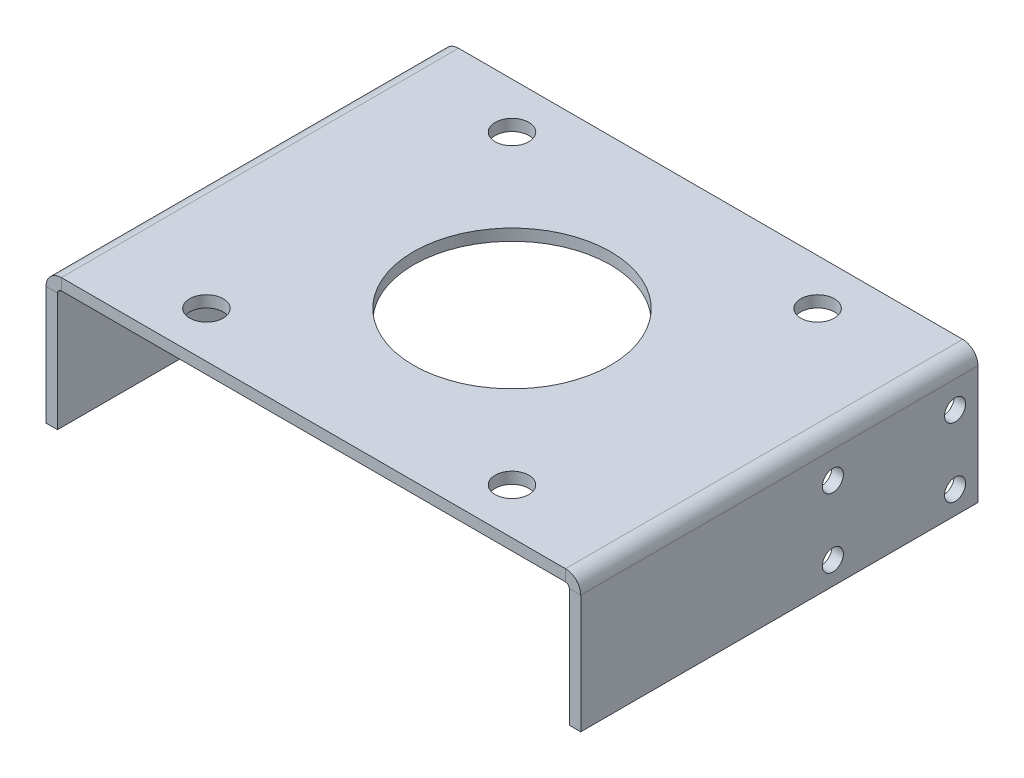
ISO-10303-21;
HEADER;
FILE_DESCRIPTION(('STEP AP214'),'2;1');
FILE_NAME('part.step','',(''),(''),'','','');
FILE_SCHEMA(('AUTOMOTIVE_DESIGN { 1 0 10303 214 1 1 1 1 }'));
ENDSEC;
DATA;
#1=APPLICATION_CONTEXT('core data for automotive mechanical design processes');
#2=APPLICATION_PROTOCOL_DEFINITION('international standard','automotive_design',2000,#1);
#3=PRODUCT_CONTEXT('',#1,'mechanical');
#4=PRODUCT('Part','Part','',(#3));
#5=PRODUCT_RELATED_PRODUCT_CATEGORY('part','',(#4));
#6=PRODUCT_DEFINITION_FORMATION('','',#4);
#7=PRODUCT_DEFINITION_CONTEXT('part definition',#1,'design');
#8=PRODUCT_DEFINITION('design','',#6,#7);
#9=PRODUCT_DEFINITION_SHAPE('','',#8);
#10=(LENGTH_UNIT() NAMED_UNIT(*) SI_UNIT(.MILLI.,.METRE.));
#11=(NAMED_UNIT(*) PLANE_ANGLE_UNIT() SI_UNIT($,.RADIAN.));
#12=(NAMED_UNIT(*) SI_UNIT($,.STERADIAN.) SOLID_ANGLE_UNIT());
#13=UNCERTAINTY_MEASURE_WITH_UNIT(LENGTH_MEASURE(1.E-05),#10,'distance_accuracy_value','');
#14=(GEOMETRIC_REPRESENTATION_CONTEXT(3) GLOBAL_UNCERTAINTY_ASSIGNED_CONTEXT((#13)) GLOBAL_UNIT_ASSIGNED_CONTEXT((#10,
#11,#12)) REPRESENTATION_CONTEXT('',''));
#15=CARTESIAN_POINT('',(0.,0.,0.));
#16=DIRECTION('',(0.,0.,1.));
#17=DIRECTION('',(1.,0.,0.));
#18=AXIS2_PLACEMENT_3D('',#15,#16,#17);
#19=CARTESIAN_POINT('',(-66.,0.,104.));
#20=DIRECTION('',(0.,0.,1.));
#21=DIRECTION('',(1.,0.,0.));
#22=AXIS2_PLACEMENT_3D('',#19,#20,#21);
#23=PLANE('',#22);
#24=DIRECTION('',(0.,-1.,0.));
#25=VECTOR('',#24,1.);
#26=CARTESIAN_POINT('',(-66.,0.,104.));
#27=LINE('',#26,#25);
#28=CARTESIAN_POINT('',(-66.,0.,104.));
#29=VERTEX_POINT('',#28);
#30=CARTESIAN_POINT('',(-66.,-3.,104.));
#31=VERTEX_POINT('',#30);
#32=EDGE_CURVE('E11',#29,#31,#27,.T.);
#33=ORIENTED_EDGE('',*,*,#32,.F.);
#34=CARTESIAN_POINT('',(-66.,-4.,104.));
#35=DIRECTION('',(0.,0.,1.));
#36=DIRECTION('',(1.,0.,0.));
#37=AXIS2_PLACEMENT_3D('',#34,#35,#36);
#38=CIRCLE('',#37,4.);
#39=CARTESIAN_POINT('',(-70.,-4.,104.));
#40=VERTEX_POINT('',#39);
#41=EDGE_CURVE('E250',#40,#29,#38,.F.);
#42=ORIENTED_EDGE('',*,*,#41,.F.);
#43=DIRECTION('',(-1.,0.,0.));
#44=VECTOR('',#43,1.);
#45=CARTESIAN_POINT('',(-67.,-4.,104.));
#46=LINE('',#45,#44);
#47=CARTESIAN_POINT('',(-67.,-4.,104.));
#48=VERTEX_POINT('',#47);
#49=EDGE_CURVE('E47',#48,#40,#46,.T.);
#50=ORIENTED_EDGE('',*,*,#49,.F.);
#51=CARTESIAN_POINT('',(-66.,-4.,104.));
#52=DIRECTION('',(0.,0.,1.));
#53=DIRECTION('',(1.,0.,0.));
#54=AXIS2_PLACEMENT_3D('',#51,#52,#53);
#55=CIRCLE('',#54,1.);
#56=EDGE_CURVE('E148',#48,#31,#55,.F.);
#57=ORIENTED_EDGE('',*,*,#56,.T.);
#58=EDGE_LOOP('',(#33,#42,#50,#57));
#59=FACE_BOUND('',#58,.T.);
#60=ADVANCED_FACE('F39',(#59),#23,.T.);
#61=CARTESIAN_POINT('',(-67.,-4.,104.));
#62=DIRECTION('',(0.,0.,1.));
#63=DIRECTION('',(1.,0.,0.));
#64=AXIS2_PLACEMENT_3D('',#61,#62,#63);
#65=PLANE('',#64);
#66=DIRECTION('',(1.,0.,0.));
#67=VECTOR('',#66,1.);
#68=CARTESIAN_POINT('',(-70.,0.,104.));
#69=LINE('',#68,#67);
#70=CARTESIAN_POINT('',(66.,0.,104.));
#71=VERTEX_POINT('',#70);
#72=EDGE_CURVE('E142',#29,#71,#69,.T.);
#73=ORIENTED_EDGE('',*,*,#72,.F.);
#74=ORIENTED_EDGE('',*,*,#32,.T.);
#75=DIRECTION('',(1.,0.,0.));
#76=VECTOR('',#75,1.);
#77=CARTESIAN_POINT('',(-70.,-3.,104.));
#78=LINE('',#77,#76);
#79=CARTESIAN_POINT('',(66.,-3.,104.));
#80=VERTEX_POINT('',#79);
#81=EDGE_CURVE('E139',#31,#80,#78,.T.);
#82=ORIENTED_EDGE('',*,*,#81,.T.);
#83=DIRECTION('',(0.,1.,0.));
#84=VECTOR('',#83,1.);
#85=CARTESIAN_POINT('',(66.,-3.,104.));
#86=LINE('',#85,#84);
#87=EDGE_CURVE('E231',#80,#71,#86,.T.);
#88=ORIENTED_EDGE('',*,*,#87,.T.);
#89=EDGE_LOOP('',(#73,#74,#82,#88));
#90=FACE_BOUND('',#89,.T.);
#91=ADVANCED_FACE('F137',(#90),#65,.T.);
#92=CARTESIAN_POINT('',(-70.,-4.,0.));
#93=DIRECTION('',(0.,0.,-1.));
#94=DIRECTION('',(-1.,0.,0.));
#95=AXIS2_PLACEMENT_3D('',#92,#93,#94);
#96=PLANE('',#95);
#97=DIRECTION('',(1.,0.,0.));
#98=VECTOR('',#97,1.);
#99=CARTESIAN_POINT('',(-70.,-4.,0.));
#100=LINE('',#99,#98);
#101=CARTESIAN_POINT('',(-70.,-4.,0.));
#102=VERTEX_POINT('',#101);
#103=CARTESIAN_POINT('',(-67.,-4.,0.));
#104=VERTEX_POINT('',#103);
#105=EDGE_CURVE('E236',#102,#104,#100,.T.);
#106=ORIENTED_EDGE('',*,*,#105,.F.);
#107=CARTESIAN_POINT('',(-66.,-4.,0.));
#108=DIRECTION('',(0.,0.,1.));
#109=DIRECTION('',(1.,0.,0.));
#110=AXIS2_PLACEMENT_3D('',#107,#108,#109);
#111=CIRCLE('',#110,4.);
#112=CARTESIAN_POINT('',(-66.,0.,0.));
#113=VERTEX_POINT('',#112);
#114=EDGE_CURVE('E188',#102,#113,#111,.F.);
#115=ORIENTED_EDGE('',*,*,#114,.T.);
#116=DIRECTION('',(0.,1.,0.));
#117=VECTOR('',#116,1.);
#118=CARTESIAN_POINT('',(-66.,-3.,0.));
#119=LINE('',#118,#117);
#120=CARTESIAN_POINT('',(-66.,-3.,0.));
#121=VERTEX_POINT('',#120);
#122=EDGE_CURVE('E234',#121,#113,#119,.T.);
#123=ORIENTED_EDGE('',*,*,#122,.F.);
#124=CARTESIAN_POINT('',(-66.,-4.,0.));
#125=DIRECTION('',(0.,0.,1.));
#126=DIRECTION('',(1.,0.,0.));
#127=AXIS2_PLACEMENT_3D('',#124,#125,#126);
#128=CIRCLE('',#127,1.);
#129=EDGE_CURVE('E160',#104,#121,#128,.F.);
#130=ORIENTED_EDGE('',*,*,#129,.F.);
#131=EDGE_LOOP('',(#106,#115,#123,#130));
#132=FACE_BOUND('',#131,.T.);
#133=ADVANCED_FACE('F372',(#132),#96,.T.);
#134=CARTESIAN_POINT('',(-66.,-3.,0.));
#135=DIRECTION('',(0.,0.,-1.));
#136=DIRECTION('',(-1.,0.,0.));
#137=AXIS2_PLACEMENT_3D('',#134,#135,#136);
#138=PLANE('',#137);
#139=DIRECTION('',(0.,1.,0.));
#140=VECTOR('',#139,1.);
#141=CARTESIAN_POINT('',(-70.,0.,0.));
#142=LINE('',#141,#140);
#143=CARTESIAN_POINT('',(-70.,-35.,0.));
#144=VERTEX_POINT('',#143);
#145=EDGE_CURVE('E191',#144,#102,#142,.T.);
#146=ORIENTED_EDGE('',*,*,#145,.T.);
#147=ORIENTED_EDGE('',*,*,#105,.T.);
#148=DIRECTION('',(0.,1.,0.));
#149=VECTOR('',#148,1.);
#150=CARTESIAN_POINT('',(-67.,0.,0.));
#151=LINE('',#150,#149);
#152=CARTESIAN_POINT('',(-67.,-35.,0.));
#153=VERTEX_POINT('',#152);
#154=EDGE_CURVE('E197',#153,#104,#151,.T.);
#155=ORIENTED_EDGE('',*,*,#154,.F.);
#156=DIRECTION('',(-1.,0.,0.));
#157=VECTOR('',#156,1.);
#158=CARTESIAN_POINT('',(-67.,-35.,0.));
#159=LINE('',#158,#157);
#160=EDGE_CURVE('E194',#153,#144,#159,.T.);
#161=ORIENTED_EDGE('',*,*,#160,.T.);
#162=EDGE_LOOP('',(#146,#147,#155,#161));
#163=FACE_BOUND('',#162,.T.);
#164=ADVANCED_FACE('F375',(#163),#138,.T.);
#165=CARTESIAN_POINT('',(70.,-4.,104.));
#166=DIRECTION('',(0.,0.,1.));
#167=DIRECTION('',(1.,0.,0.));
#168=AXIS2_PLACEMENT_3D('',#165,#166,#167);
#169=PLANE('',#168);
#170=DIRECTION('',(-1.,0.,0.));
#171=VECTOR('',#170,1.);
#172=CARTESIAN_POINT('',(70.,-4.,104.));
#173=LINE('',#172,#171);
#174=CARTESIAN_POINT('',(70.,-4.,104.));
#175=VERTEX_POINT('',#174);
#176=CARTESIAN_POINT('',(67.,-4.,104.));
#177=VERTEX_POINT('',#176);
#178=EDGE_CURVE('E55',#175,#177,#173,.T.);
#179=ORIENTED_EDGE('',*,*,#178,.F.);
#180=CARTESIAN_POINT('',(66.,-4.,104.));
#181=DIRECTION('',(0.,0.,1.));
#182=DIRECTION('',(1.,0.,0.));
#183=AXIS2_PLACEMENT_3D('',#180,#181,#182);
#184=CIRCLE('',#183,4.);
#185=EDGE_CURVE('E260',#71,#175,#184,.F.);
#186=ORIENTED_EDGE('',*,*,#185,.F.);
#187=ORIENTED_EDGE('',*,*,#87,.F.);
#188=CARTESIAN_POINT('',(66.,-4.,104.));
#189=DIRECTION('',(0.,0.,1.));
#190=DIRECTION('',(1.,0.,0.));
#191=AXIS2_PLACEMENT_3D('',#188,#189,#190);
#192=CIRCLE('',#191,1.);
#193=EDGE_CURVE('E168',#80,#177,#192,.F.);
#194=ORIENTED_EDGE('',*,*,#193,.T.);
#195=EDGE_LOOP('',(#179,#186,#187,#194));
#196=FACE_BOUND('',#195,.T.);
#197=ADVANCED_FACE('F402',(#196),#169,.T.);
#198=CARTESIAN_POINT('',(66.,-3.,104.));
#199=DIRECTION('',(0.,0.,1.));
#200=DIRECTION('',(1.,0.,0.));
#201=AXIS2_PLACEMENT_3D('',#198,#199,#200);
#202=PLANE('',#201);
#203=DIRECTION('',(0.,-1.,0.));
#204=VECTOR('',#203,1.);
#205=CARTESIAN_POINT('',(70.,0.,104.));
#206=LINE('',#205,#204);
#207=CARTESIAN_POINT('',(70.,-35.,104.));
#208=VERTEX_POINT('',#207);
#209=EDGE_CURVE('E263',#175,#208,#206,.T.);
#210=ORIENTED_EDGE('',*,*,#209,.F.);
#211=ORIENTED_EDGE('',*,*,#178,.T.);
#212=DIRECTION('',(0.,-1.,0.));
#213=VECTOR('',#212,1.);
#214=CARTESIAN_POINT('',(67.,0.,104.));
#215=LINE('',#214,#213);
#216=CARTESIAN_POINT('',(67.,-35.,104.));
#217=VERTEX_POINT('',#216);
#218=EDGE_CURVE('E109',#177,#217,#215,.T.);
#219=ORIENTED_EDGE('',*,*,#218,.T.);
#220=DIRECTION('',(-1.,0.,0.));
#221=VECTOR('',#220,1.);
#222=CARTESIAN_POINT('',(70.,-35.,104.));
#223=LINE('',#222,#221);
#224=EDGE_CURVE('E266',#208,#217,#223,.T.);
#225=ORIENTED_EDGE('',*,*,#224,.F.);
#226=EDGE_LOOP('',(#210,#211,#219,#225));
#227=FACE_BOUND('',#226,.T.);
#228=ADVANCED_FACE('F405',(#227),#202,.T.);
#229=CARTESIAN_POINT('',(66.,0.,0.));
#230=DIRECTION('',(0.,0.,-1.));
#231=DIRECTION('',(-1.,0.,0.));
#232=AXIS2_PLACEMENT_3D('',#229,#230,#231);
#233=PLANE('',#232);
#234=DIRECTION('',(0.,-1.,0.));
#235=VECTOR('',#234,1.);
#236=CARTESIAN_POINT('',(66.,0.,0.));
#237=LINE('',#236,#235);
#238=CARTESIAN_POINT('',(66.,0.,0.));
#239=VERTEX_POINT('',#238);
#240=CARTESIAN_POINT('',(66.,-3.,0.));
#241=VERTEX_POINT('',#240);
#242=EDGE_CURVE('E96',#239,#241,#237,.T.);
#243=ORIENTED_EDGE('',*,*,#242,.F.);
#244=CARTESIAN_POINT('',(66.,-4.,0.));
#245=DIRECTION('',(0.,0.,1.));
#246=DIRECTION('',(1.,0.,0.));
#247=AXIS2_PLACEMENT_3D('',#244,#245,#246);
#248=CIRCLE('',#247,4.);
#249=CARTESIAN_POINT('',(70.,-4.,0.));
#250=VERTEX_POINT('',#249);
#251=EDGE_CURVE('E184',#239,#250,#248,.F.);
#252=ORIENTED_EDGE('',*,*,#251,.T.);
#253=DIRECTION('',(1.,0.,0.));
#254=VECTOR('',#253,1.);
#255=CARTESIAN_POINT('',(67.,-4.,0.));
#256=LINE('',#255,#254);
#257=CARTESIAN_POINT('',(67.,-4.,0.));
#258=VERTEX_POINT('',#257);
#259=EDGE_CURVE('E103',#258,#250,#256,.T.);
#260=ORIENTED_EDGE('',*,*,#259,.F.);
#261=CARTESIAN_POINT('',(66.,-4.,0.));
#262=DIRECTION('',(0.,0.,1.));
#263=DIRECTION('',(1.,0.,0.));
#264=AXIS2_PLACEMENT_3D('',#261,#262,#263);
#265=CIRCLE('',#264,1.);
#266=EDGE_CURVE('E203',#241,#258,#265,.F.);
#267=ORIENTED_EDGE('',*,*,#266,.F.);
#268=EDGE_LOOP('',(#243,#252,#260,#267));
#269=FACE_BOUND('',#268,.T.);
#270=ADVANCED_FACE('F409',(#269),#233,.T.);
#271=CARTESIAN_POINT('',(67.,-4.,0.));
#272=DIRECTION('',(0.,0.,-1.));
#273=DIRECTION('',(-1.,0.,0.));
#274=AXIS2_PLACEMENT_3D('',#271,#272,#273);
#275=PLANE('',#274);
#276=DIRECTION('',(1.,0.,0.));
#277=VECTOR('',#276,1.);
#278=CARTESIAN_POINT('',(-70.,0.,0.));
#279=LINE('',#278,#277);
#280=EDGE_CURVE('E186',#113,#239,#279,.T.);
#281=ORIENTED_EDGE('',*,*,#280,.T.);
#282=ORIENTED_EDGE('',*,*,#242,.T.);
#283=DIRECTION('',(1.,0.,0.));
#284=VECTOR('',#283,1.);
#285=CARTESIAN_POINT('',(-70.,-3.,0.));
#286=LINE('',#285,#284);
#287=EDGE_CURVE('E201',#121,#241,#286,.T.);
#288=ORIENTED_EDGE('',*,*,#287,.F.);
#289=ORIENTED_EDGE('',*,*,#122,.T.);
#290=EDGE_LOOP('',(#281,#282,#288,#289));
#291=FACE_BOUND('',#290,.T.);
#292=ADVANCED_FACE('F412',(#291),#275,.T.);
#293=CARTESIAN_POINT('',(67.,0.,104.));
#294=DIRECTION('',(1.,0.,0.));
#295=DIRECTION('',(0.,1.,0.));
#296=AXIS2_PLACEMENT_3D('',#293,#294,#295);
#297=PLANE('',#296);
#298=CARTESIAN_POINT('',(67.,-29.,6.));
#299=DIRECTION('',(-1.,0.,0.));
#300=DIRECTION('',(0.,-1.,0.));
#301=AXIS2_PLACEMENT_3D('',#298,#299,#300);
#302=CIRCLE('',#301,2.75000000000001);
#303=CARTESIAN_POINT('',(67.,-31.75,6.));
#304=VERTEX_POINT('',#303);
#305=EDGE_CURVE('E303',#304,#304,#302,.T.);
#306=ORIENTED_EDGE('',*,*,#305,.F.);
#307=EDGE_LOOP('',(#306));
#308=FACE_BOUND('',#307,.T.);
#309=CARTESIAN_POINT('',(67.,-11.,6.));
#310=DIRECTION('',(-1.,0.,0.));
#311=DIRECTION('',(0.,-1.,0.));
#312=AXIS2_PLACEMENT_3D('',#309,#310,#311);
#313=CIRCLE('',#312,2.75000000000001);
#314=CARTESIAN_POINT('',(67.,-13.75,6.));
#315=VERTEX_POINT('',#314);
#316=EDGE_CURVE('E310',#315,#315,#313,.T.);
#317=ORIENTED_EDGE('',*,*,#316,.F.);
#318=EDGE_LOOP('',(#317));
#319=FACE_BOUND('',#318,.T.);
#320=CARTESIAN_POINT('',(67.,-11.,38.));
#321=DIRECTION('',(-1.,0.,0.));
#322=DIRECTION('',(0.,-1.,0.));
#323=AXIS2_PLACEMENT_3D('',#320,#321,#322);
#324=CIRCLE('',#323,2.75000000000001);
#325=CARTESIAN_POINT('',(67.,-13.75,38.));
#326=VERTEX_POINT('',#325);
#327=EDGE_CURVE('E297',#326,#326,#324,.T.);
#328=ORIENTED_EDGE('',*,*,#327,.F.);
#329=EDGE_LOOP('',(#328));
#330=FACE_BOUND('',#329,.T.);
#331=CARTESIAN_POINT('',(67.,-29.,38.));
#332=DIRECTION('',(-1.,0.,0.));
#333=DIRECTION('',(0.,-1.,0.));
#334=AXIS2_PLACEMENT_3D('',#331,#332,#333);
#335=CIRCLE('',#334,2.75000000000001);
#336=CARTESIAN_POINT('',(67.,-31.75,38.));
#337=VERTEX_POINT('',#336);
#338=EDGE_CURVE('E280',#337,#337,#335,.T.);
#339=ORIENTED_EDGE('',*,*,#338,.F.);
#340=EDGE_LOOP('',(#339));
#341=FACE_BOUND('',#340,.T.);
#342=DIRECTION('',(0.,-1.,0.));
#343=VECTOR('',#342,1.);
#344=CARTESIAN_POINT('',(67.,0.,0.));
#345=LINE('',#344,#343);
#346=CARTESIAN_POINT('',(67.,-35.,0.));
#347=VERTEX_POINT('',#346);
#348=EDGE_CURVE('E174',#258,#347,#345,.T.);
#349=ORIENTED_EDGE('',*,*,#348,.T.);
#350=DIRECTION('',(0.,0.,-1.));
#351=VECTOR('',#350,1.);
#352=CARTESIAN_POINT('',(67.,-35.,104.));
#353=LINE('',#352,#351);
#354=EDGE_CURVE('E227',#217,#347,#353,.T.);
#355=ORIENTED_EDGE('',*,*,#354,.F.);
#356=ORIENTED_EDGE('',*,*,#218,.F.);
#357=DIRECTION('',(0.,0.,-1.));
#358=VECTOR('',#357,1.);
#359=CARTESIAN_POINT('',(67.,-4.,104.));
#360=LINE('',#359,#358);
#361=EDGE_CURVE('E170',#177,#258,#360,.T.);
#362=ORIENTED_EDGE('',*,*,#361,.T.);
#363=EDGE_LOOP('',(#349,#355,#356,#362));
#364=FACE_BOUND('',#363,.T.);
#365=ADVANCED_FACE('F415',(#308,#319,#330,#341,#364),#297,.F.);
#366=CARTESIAN_POINT('',(70.,-35.,104.));
#367=DIRECTION('',(0.,-1.,0.));
#368=DIRECTION('',(0.,0.,-1.));
#369=AXIS2_PLACEMENT_3D('',#366,#367,#368);
#370=PLANE('',#369);
#371=DIRECTION('',(-1.,0.,0.));
#372=VECTOR('',#371,1.);
#373=CARTESIAN_POINT('',(70.,-35.,0.));
#374=LINE('',#373,#372);
#375=CARTESIAN_POINT('',(70.,-35.,0.));
#376=VERTEX_POINT('',#375);
#377=EDGE_CURVE('E177',#376,#347,#374,.T.);
#378=ORIENTED_EDGE('',*,*,#377,.F.);
#379=DIRECTION('',(0.,0.,-1.));
#380=VECTOR('',#379,1.);
#381=CARTESIAN_POINT('',(70.,-35.,104.));
#382=LINE('',#381,#380);
#383=EDGE_CURVE('E225',#208,#376,#382,.T.);
#384=ORIENTED_EDGE('',*,*,#383,.F.);
#385=ORIENTED_EDGE('',*,*,#224,.T.);
#386=ORIENTED_EDGE('',*,*,#354,.T.);
#387=EDGE_LOOP('',(#378,#384,#385,#386));
#388=FACE_BOUND('',#387,.T.);
#389=ADVANCED_FACE('F418',(#388),#370,.T.);
#390=CARTESIAN_POINT('',(70.,0.,104.));
#391=DIRECTION('',(1.,0.,0.));
#392=DIRECTION('',(0.,1.,0.));
#393=AXIS2_PLACEMENT_3D('',#390,#391,#392);
#394=PLANE('',#393);
#395=CARTESIAN_POINT('',(70.,-29.,6.));
#396=DIRECTION('',(-1.,0.,0.));
#397=DIRECTION('',(0.,-1.,0.));
#398=AXIS2_PLACEMENT_3D('',#395,#396,#397);
#399=CIRCLE('',#398,2.75000000000001);
#400=CARTESIAN_POINT('',(70.,-31.75,6.));
#401=VERTEX_POINT('',#400);
#402=EDGE_CURVE('E300',#401,#401,#399,.T.);
#403=ORIENTED_EDGE('',*,*,#402,.T.);
#404=EDGE_LOOP('',(#403));
#405=FACE_BOUND('',#404,.T.);
#406=CARTESIAN_POINT('',(70.,-11.,6.));
#407=DIRECTION('',(-1.,0.,0.));
#408=DIRECTION('',(0.,-1.,0.));
#409=AXIS2_PLACEMENT_3D('',#406,#407,#408);
#410=CIRCLE('',#409,2.75000000000001);
#411=CARTESIAN_POINT('',(70.,-13.75,6.));
#412=VERTEX_POINT('',#411);
#413=EDGE_CURVE('E307',#412,#412,#410,.T.);
#414=ORIENTED_EDGE('',*,*,#413,.T.);
#415=EDGE_LOOP('',(#414));
#416=FACE_BOUND('',#415,.T.);
#417=CARTESIAN_POINT('',(70.,-11.,38.));
#418=DIRECTION('',(-1.,0.,0.));
#419=DIRECTION('',(0.,-1.,0.));
#420=AXIS2_PLACEMENT_3D('',#417,#418,#419);
#421=CIRCLE('',#420,2.75000000000001);
#422=CARTESIAN_POINT('',(70.,-13.75,38.));
#423=VERTEX_POINT('',#422);
#424=EDGE_CURVE('E313',#423,#423,#421,.T.);
#425=ORIENTED_EDGE('',*,*,#424,.T.);
#426=EDGE_LOOP('',(#425));
#427=FACE_BOUND('',#426,.T.);
#428=CARTESIAN_POINT('',(70.,-29.,38.));
#429=DIRECTION('',(-1.,0.,0.));
#430=DIRECTION('',(0.,-1.,0.));
#431=AXIS2_PLACEMENT_3D('',#428,#429,#430);
#432=CIRCLE('',#431,2.75000000000001);
#433=CARTESIAN_POINT('',(70.,-31.75,38.));
#434=VERTEX_POINT('',#433);
#435=EDGE_CURVE('E294',#434,#434,#432,.T.);
#436=ORIENTED_EDGE('',*,*,#435,.T.);
#437=EDGE_LOOP('',(#436));
#438=FACE_BOUND('',#437,.T.);
#439=DIRECTION('',(0.,-1.,0.));
#440=VECTOR('',#439,1.);
#441=CARTESIAN_POINT('',(70.,0.,0.));
#442=LINE('',#441,#440);
#443=EDGE_CURVE('E181',#250,#376,#442,.T.);
#444=ORIENTED_EDGE('',*,*,#443,.F.);
#445=DIRECTION('',(0.,0.,-1.));
#446=VECTOR('',#445,1.);
#447=CARTESIAN_POINT('',(70.,-4.,104.));
#448=LINE('',#447,#446);
#449=EDGE_CURVE('E222',#175,#250,#448,.T.);
#450=ORIENTED_EDGE('',*,*,#449,.F.);
#451=ORIENTED_EDGE('',*,*,#209,.T.);
#452=ORIENTED_EDGE('',*,*,#383,.T.);
#453=EDGE_LOOP('',(#444,#450,#451,#452));
#454=FACE_BOUND('',#453,.T.);
#455=ADVANCED_FACE('F422',(#405,#416,#427,#438,#454),#394,.T.);
#456=CARTESIAN_POINT('',(66.,-4.,104.));
#457=DIRECTION('',(0.,0.,-1.));
#458=DIRECTION('',(-1.,0.,0.));
#459=AXIS2_PLACEMENT_3D('',#456,#457,#458);
#460=CYLINDRICAL_SURFACE('',#459,4.);
#461=ORIENTED_EDGE('',*,*,#251,.F.);
#462=DIRECTION('',(0.,0.,-1.));
#463=VECTOR('',#462,1.);
#464=CARTESIAN_POINT('',(66.,0.,104.));
#465=LINE('',#464,#463);
#466=EDGE_CURVE('E219',#71,#239,#465,.T.);
#467=ORIENTED_EDGE('',*,*,#466,.F.);
#468=ORIENTED_EDGE('',*,*,#185,.T.);
#469=ORIENTED_EDGE('',*,*,#449,.T.);
#470=EDGE_LOOP('',(#461,#467,#468,#469));
#471=FACE_BOUND('',#470,.T.);
#472=ADVANCED_FACE('F361',(#471),#460,.T.);
#473=CARTESIAN_POINT('',(-70.,0.,104.));
#474=DIRECTION('',(0.,1.,0.));
#475=DIRECTION('',(0.,0.,1.));
#476=AXIS2_PLACEMENT_3D('',#473,#474,#475);
#477=PLANE('',#476);
#478=CARTESIAN_POINT('',(40.,0.,92.));
#479=DIRECTION('',(0.,1.,0.));
#480=DIRECTION('',(0.,0.,1.));
#481=AXIS2_PLACEMENT_3D('',#478,#479,#480);
#482=CIRCLE('',#481,4.4);
#483=CARTESIAN_POINT('',(40.,0.,96.4));
#484=VERTEX_POINT('',#483);
#485=EDGE_CURVE('E330',#484,#484,#482,.T.);
#486=ORIENTED_EDGE('',*,*,#485,.F.);
#487=EDGE_LOOP('',(#486));
#488=FACE_BOUND('',#487,.T.);
#489=CARTESIAN_POINT('',(-40.,0.,92.));
#490=DIRECTION('',(0.,1.,0.));
#491=DIRECTION('',(0.,0.,1.));
#492=AXIS2_PLACEMENT_3D('',#489,#490,#491);
#493=CIRCLE('',#492,4.4);
#494=CARTESIAN_POINT('',(-40.,0.,96.4));
#495=VERTEX_POINT('',#494);
#496=EDGE_CURVE('E336',#495,#495,#493,.T.);
#497=ORIENTED_EDGE('',*,*,#496,.F.);
#498=EDGE_LOOP('',(#497));
#499=FACE_BOUND('',#498,.T.);
#500=CARTESIAN_POINT('',(-40.,0.,12.));
#501=DIRECTION('',(0.,1.,0.));
#502=DIRECTION('',(0.,0.,1.));
#503=AXIS2_PLACEMENT_3D('',#500,#501,#502);
#504=CIRCLE('',#503,4.4);
#505=CARTESIAN_POINT('',(-40.,0.,16.4));
#506=VERTEX_POINT('',#505);
#507=EDGE_CURVE('E342',#506,#506,#504,.T.);
#508=ORIENTED_EDGE('',*,*,#507,.F.);
#509=EDGE_LOOP('',(#508));
#510=FACE_BOUND('',#509,.T.);
#511=CARTESIAN_POINT('',(40.,0.,12.));
#512=DIRECTION('',(0.,1.,0.));
#513=DIRECTION('',(0.,0.,1.));
#514=AXIS2_PLACEMENT_3D('',#511,#512,#513);
#515=CIRCLE('',#514,4.4);
#516=CARTESIAN_POINT('',(40.,0.,16.4));
#517=VERTEX_POINT('',#516);
#518=EDGE_CURVE('E324',#517,#517,#515,.T.);
#519=ORIENTED_EDGE('',*,*,#518,.F.);
#520=EDGE_LOOP('',(#519));
#521=FACE_BOUND('',#520,.T.);
#522=CARTESIAN_POINT('',(0.,0.,52.));
#523=DIRECTION('',(0.,1.,0.));
#524=DIRECTION('',(0.,0.,1.));
#525=AXIS2_PLACEMENT_3D('',#522,#523,#524);
#526=CIRCLE('',#525,25.78);
#527=CARTESIAN_POINT('',(0.,0.,77.78));
#528=VERTEX_POINT('',#527);
#529=EDGE_CURVE('E318',#528,#528,#526,.T.);
#530=ORIENTED_EDGE('',*,*,#529,.F.);
#531=EDGE_LOOP('',(#530));
#532=FACE_BOUND('',#531,.T.);
#533=ORIENTED_EDGE('',*,*,#280,.F.);
#534=DIRECTION('',(0.,0.,-1.));
#535=VECTOR('',#534,1.);
#536=CARTESIAN_POINT('',(-66.,0.,104.));
#537=LINE('',#536,#535);
#538=EDGE_CURVE('E216',#29,#113,#537,.T.);
#539=ORIENTED_EDGE('',*,*,#538,.F.);
#540=ORIENTED_EDGE('',*,*,#72,.T.);
#541=ORIENTED_EDGE('',*,*,#466,.T.);
#542=EDGE_LOOP('',(#533,#539,#540,#541));
#543=FACE_BOUND('',#542,.T.);
#544=ADVANCED_FACE('F358',(#488,#499,#510,#521,#532,#543),#477,.T.);
#545=CARTESIAN_POINT('',(-66.,-4.,104.));
#546=DIRECTION('',(0.,0.,-1.));
#547=DIRECTION('',(-1.,0.,0.));
#548=AXIS2_PLACEMENT_3D('',#545,#546,#547);
#549=CYLINDRICAL_SURFACE('',#548,4.);
#550=ORIENTED_EDGE('',*,*,#114,.F.);
#551=DIRECTION('',(0.,0.,-1.));
#552=VECTOR('',#551,1.);
#553=CARTESIAN_POINT('',(-70.,-4.,104.));
#554=LINE('',#553,#552);
#555=EDGE_CURVE('E213',#40,#102,#554,.T.);
#556=ORIENTED_EDGE('',*,*,#555,.F.);
#557=ORIENTED_EDGE('',*,*,#41,.T.);
#558=ORIENTED_EDGE('',*,*,#538,.T.);
#559=EDGE_LOOP('',(#550,#556,#557,#558));
#560=FACE_BOUND('',#559,.T.);
#561=ADVANCED_FACE('F249',(#560),#549,.T.);
#562=CARTESIAN_POINT('',(-70.,0.,104.));
#563=DIRECTION('',(-1.,0.,0.));
#564=DIRECTION('',(0.,-1.,0.));
#565=AXIS2_PLACEMENT_3D('',#562,#563,#564);
#566=PLANE('',#565);
#567=CARTESIAN_POINT('',(-70.,-29.,6.));
#568=DIRECTION('',(-1.,0.,0.));
#569=DIRECTION('',(0.,-1.,0.));
#570=AXIS2_PLACEMENT_3D('',#567,#568,#569);
#571=CIRCLE('',#570,2.75000000000001);
#572=CARTESIAN_POINT('',(-70.,-31.75,6.));
#573=VERTEX_POINT('',#572);
#574=EDGE_CURVE('E276',#573,#573,#571,.T.);
#575=ORIENTED_EDGE('',*,*,#574,.F.);
#576=EDGE_LOOP('',(#575));
#577=FACE_BOUND('',#576,.T.);
#578=CARTESIAN_POINT('',(-70.,-11.,6.));
#579=DIRECTION('',(-1.,0.,0.));
#580=DIRECTION('',(0.,-1.,0.));
#581=AXIS2_PLACEMENT_3D('',#578,#579,#580);
#582=CIRCLE('',#581,2.75000000000001);
#583=CARTESIAN_POINT('',(-70.,-13.75,6.));
#584=VERTEX_POINT('',#583);
#585=EDGE_CURVE('E283',#584,#584,#582,.T.);
#586=ORIENTED_EDGE('',*,*,#585,.F.);
#587=EDGE_LOOP('',(#586));
#588=FACE_BOUND('',#587,.T.);
#589=CARTESIAN_POINT('',(-70.,-11.,38.));
#590=DIRECTION('',(-1.,0.,0.));
#591=DIRECTION('',(0.,-1.,0.));
#592=AXIS2_PLACEMENT_3D('',#589,#590,#591);
#593=CIRCLE('',#592,2.75000000000001);
#594=CARTESIAN_POINT('',(-70.,-13.75,38.));
#595=VERTEX_POINT('',#594);
#596=EDGE_CURVE('E289',#595,#595,#593,.T.);
#597=ORIENTED_EDGE('',*,*,#596,.F.);
#598=EDGE_LOOP('',(#597));
#599=FACE_BOUND('',#598,.T.);
#600=CARTESIAN_POINT('',(-70.,-29.,38.));
#601=DIRECTION('',(-1.,0.,0.));
#602=DIRECTION('',(0.,-1.,0.));
#603=AXIS2_PLACEMENT_3D('',#600,#601,#602);
#604=CIRCLE('',#603,2.75000000000001);
#605=CARTESIAN_POINT('',(-70.,-31.75,38.));
#606=VERTEX_POINT('',#605);
#607=EDGE_CURVE('E270',#606,#606,#604,.T.);
#608=ORIENTED_EDGE('',*,*,#607,.F.);
#609=EDGE_LOOP('',(#608));
#610=FACE_BOUND('',#609,.T.);
#611=ORIENTED_EDGE('',*,*,#145,.F.);
#612=DIRECTION('',(0.,0.,-1.));
#613=VECTOR('',#612,1.);
#614=CARTESIAN_POINT('',(-70.,-35.,104.));
#615=LINE('',#614,#613);
#616=CARTESIAN_POINT('',(-70.,-35.,104.));
#617=VERTEX_POINT('',#616);
#618=EDGE_CURVE('E211',#617,#144,#615,.T.);
#619=ORIENTED_EDGE('',*,*,#618,.F.);
#620=DIRECTION('',(0.,1.,0.));
#621=VECTOR('',#620,1.);
#622=CARTESIAN_POINT('',(-70.,0.,104.));
#623=LINE('',#622,#621);
#624=EDGE_CURVE('E243',#617,#40,#623,.T.);
#625=ORIENTED_EDGE('',*,*,#624,.T.);
#626=ORIENTED_EDGE('',*,*,#555,.T.);
#627=EDGE_LOOP('',(#611,#619,#625,#626));
#628=FACE_BOUND('',#627,.T.);
#629=ADVANCED_FACE('F254',(#577,#588,#599,#610,#628),#566,.T.);
#630=CARTESIAN_POINT('',(-67.,-35.,104.));
#631=DIRECTION('',(0.,-1.,0.));
#632=DIRECTION('',(0.,0.,-1.));
#633=AXIS2_PLACEMENT_3D('',#630,#631,#632);
#634=PLANE('',#633);
#635=ORIENTED_EDGE('',*,*,#160,.F.);
#636=DIRECTION('',(0.,0.,-1.));
#637=VECTOR('',#636,1.);
#638=CARTESIAN_POINT('',(-67.,-35.,104.));
#639=LINE('',#638,#637);
#640=CARTESIAN_POINT('',(-67.,-35.,104.));
#641=VERTEX_POINT('',#640);
#642=EDGE_CURVE('E209',#641,#153,#639,.T.);
#643=ORIENTED_EDGE('',*,*,#642,.F.);
#644=DIRECTION('',(-1.,0.,0.));
#645=VECTOR('',#644,1.);
#646=CARTESIAN_POINT('',(-67.,-35.,104.));
#647=LINE('',#646,#645);
#648=EDGE_CURVE('E255',#641,#617,#647,.T.);
#649=ORIENTED_EDGE('',*,*,#648,.T.);
#650=ORIENTED_EDGE('',*,*,#618,.T.);
#651=EDGE_LOOP('',(#635,#643,#649,#650));
#652=FACE_BOUND('',#651,.T.);
#653=ADVANCED_FACE('F380',(#652),#634,.T.);
#654=CARTESIAN_POINT('',(-67.,0.,104.));
#655=DIRECTION('',(-1.,0.,0.));
#656=DIRECTION('',(0.,-1.,0.));
#657=AXIS2_PLACEMENT_3D('',#654,#655,#656);
#658=PLANE('',#657);
#659=CARTESIAN_POINT('',(-67.,-29.,6.));
#660=DIRECTION('',(-1.,0.,0.));
#661=DIRECTION('',(0.,-1.,0.));
#662=AXIS2_PLACEMENT_3D('',#659,#660,#661);
#663=CIRCLE('',#662,2.75000000000001);
#664=CARTESIAN_POINT('',(-67.,-31.75,6.));
#665=VERTEX_POINT('',#664);
#666=EDGE_CURVE('E279',#665,#665,#663,.T.);
#667=ORIENTED_EDGE('',*,*,#666,.T.);
#668=EDGE_LOOP('',(#667));
#669=FACE_BOUND('',#668,.T.);
#670=CARTESIAN_POINT('',(-67.,-11.,6.));
#671=DIRECTION('',(-1.,0.,0.));
#672=DIRECTION('',(0.,-1.,0.));
#673=AXIS2_PLACEMENT_3D('',#670,#671,#672);
#674=CIRCLE('',#673,2.75000000000001);
#675=CARTESIAN_POINT('',(-67.,-13.75,6.));
#676=VERTEX_POINT('',#675);
#677=EDGE_CURVE('E286',#676,#676,#674,.T.);
#678=ORIENTED_EDGE('',*,*,#677,.T.);
#679=EDGE_LOOP('',(#678));
#680=FACE_BOUND('',#679,.T.);
#681=CARTESIAN_POINT('',(-67.,-11.,38.));
#682=DIRECTION('',(-1.,0.,0.));
#683=DIRECTION('',(0.,-1.,0.));
#684=AXIS2_PLACEMENT_3D('',#681,#682,#683);
#685=CIRCLE('',#684,2.75000000000001);
#686=CARTESIAN_POINT('',(-67.,-13.75,38.));
#687=VERTEX_POINT('',#686);
#688=EDGE_CURVE('E273',#687,#687,#685,.T.);
#689=ORIENTED_EDGE('',*,*,#688,.T.);
#690=EDGE_LOOP('',(#689));
#691=FACE_BOUND('',#690,.T.);
#692=CARTESIAN_POINT('',(-67.,-29.,38.));
#693=DIRECTION('',(-1.,0.,0.));
#694=DIRECTION('',(0.,-1.,0.));
#695=AXIS2_PLACEMENT_3D('',#692,#693,#694);
#696=CIRCLE('',#695,2.75000000000001);
#697=CARTESIAN_POINT('',(-67.,-31.75,38.));
#698=VERTEX_POINT('',#697);
#699=EDGE_CURVE('E178',#698,#698,#696,.T.);
#700=ORIENTED_EDGE('',*,*,#699,.T.);
#701=EDGE_LOOP('',(#700));
#702=FACE_BOUND('',#701,.T.);
#703=ORIENTED_EDGE('',*,*,#154,.T.);
#704=DIRECTION('',(0.,0.,-1.));
#705=VECTOR('',#704,1.);
#706=CARTESIAN_POINT('',(-67.,-4.,104.));
#707=LINE('',#706,#705);
#708=EDGE_CURVE('E162',#48,#104,#707,.T.);
#709=ORIENTED_EDGE('',*,*,#708,.F.);
#710=DIRECTION('',(0.,1.,0.));
#711=VECTOR('',#710,1.);
#712=CARTESIAN_POINT('',(-67.,0.,104.));
#713=LINE('',#712,#711);
#714=EDGE_CURVE('E153',#641,#48,#713,.T.);
#715=ORIENTED_EDGE('',*,*,#714,.F.);
#716=ORIENTED_EDGE('',*,*,#642,.T.);
#717=EDGE_LOOP('',(#703,#709,#715,#716));
#718=FACE_BOUND('',#717,.T.);
#719=ADVANCED_FACE('F378',(#669,#680,#691,#702,#718),#658,.F.);
#720=CARTESIAN_POINT('',(-66.,-4.,104.));
#721=DIRECTION('',(0.,0.,-1.));
#722=DIRECTION('',(-1.,0.,0.));
#723=AXIS2_PLACEMENT_3D('',#720,#721,#722);
#724=CYLINDRICAL_SURFACE('',#723,1.);
#725=ORIENTED_EDGE('',*,*,#129,.T.);
#726=DIRECTION('',(0.,0.,-1.));
#727=VECTOR('',#726,1.);
#728=CARTESIAN_POINT('',(-66.,-3.,104.));
#729=LINE('',#728,#727);
#730=EDGE_CURVE('E157',#31,#121,#729,.T.);
#731=ORIENTED_EDGE('',*,*,#730,.F.);
#732=ORIENTED_EDGE('',*,*,#56,.F.);
#733=ORIENTED_EDGE('',*,*,#708,.T.);
#734=EDGE_LOOP('',(#725,#731,#732,#733));
#735=FACE_BOUND('',#734,.T.);
#736=ADVANCED_FACE('F158',(#735),#724,.F.);
#737=CARTESIAN_POINT('',(-70.,-3.,104.));
#738=DIRECTION('',(0.,1.,0.));
#739=DIRECTION('',(0.,0.,1.));
#740=AXIS2_PLACEMENT_3D('',#737,#738,#739);
#741=PLANE('',#740);
#742=CARTESIAN_POINT('',(40.,-3.,92.));
#743=DIRECTION('',(0.,1.,0.));
#744=DIRECTION('',(0.,0.,1.));
#745=AXIS2_PLACEMENT_3D('',#742,#743,#744);
#746=CIRCLE('',#745,4.4);
#747=CARTESIAN_POINT('',(40.,-3.,96.4));
#748=VERTEX_POINT('',#747);
#749=EDGE_CURVE('E333',#748,#748,#746,.T.);
#750=ORIENTED_EDGE('',*,*,#749,.T.);
#751=EDGE_LOOP('',(#750));
#752=FACE_BOUND('',#751,.T.);
#753=CARTESIAN_POINT('',(-40.,-3.,92.));
#754=DIRECTION('',(0.,1.,0.));
#755=DIRECTION('',(0.,0.,1.));
#756=AXIS2_PLACEMENT_3D('',#753,#754,#755);
#757=CIRCLE('',#756,4.4);
#758=CARTESIAN_POINT('',(-40.,-3.,96.4));
#759=VERTEX_POINT('',#758);
#760=EDGE_CURVE('E339',#759,#759,#757,.T.);
#761=ORIENTED_EDGE('',*,*,#760,.T.);
#762=EDGE_LOOP('',(#761));
#763=FACE_BOUND('',#762,.T.);
#764=CARTESIAN_POINT('',(-40.,-3.,12.));
#765=DIRECTION('',(0.,1.,0.));
#766=DIRECTION('',(0.,0.,1.));
#767=AXIS2_PLACEMENT_3D('',#764,#765,#766);
#768=CIRCLE('',#767,4.4);
#769=CARTESIAN_POINT('',(-40.,-3.,16.4));
#770=VERTEX_POINT('',#769);
#771=EDGE_CURVE('E327',#770,#770,#768,.T.);
#772=ORIENTED_EDGE('',*,*,#771,.T.);
#773=EDGE_LOOP('',(#772));
#774=FACE_BOUND('',#773,.T.);
#775=CARTESIAN_POINT('',(40.,-3.,12.));
#776=DIRECTION('',(0.,1.,0.));
#777=DIRECTION('',(0.,0.,1.));
#778=AXIS2_PLACEMENT_3D('',#775,#776,#777);
#779=CIRCLE('',#778,4.4);
#780=CARTESIAN_POINT('',(40.,-3.,16.4));
#781=VERTEX_POINT('',#780);
#782=EDGE_CURVE('E321',#781,#781,#779,.T.);
#783=ORIENTED_EDGE('',*,*,#782,.T.);
#784=EDGE_LOOP('',(#783));
#785=FACE_BOUND('',#784,.T.);
#786=CARTESIAN_POINT('',(0.,-3.,52.));
#787=DIRECTION('',(0.,1.,0.));
#788=DIRECTION('',(0.,0.,1.));
#789=AXIS2_PLACEMENT_3D('',#786,#787,#788);
#790=CIRCLE('',#789,25.78);
#791=CARTESIAN_POINT('',(0.,-3.,77.78));
#792=VERTEX_POINT('',#791);
#793=EDGE_CURVE('E304',#792,#792,#790,.T.);
#794=ORIENTED_EDGE('',*,*,#793,.T.);
#795=EDGE_LOOP('',(#794));
#796=FACE_BOUND('',#795,.T.);
#797=ORIENTED_EDGE('',*,*,#287,.T.);
#798=DIRECTION('',(0.,0.,-1.));
#799=VECTOR('',#798,1.);
#800=CARTESIAN_POINT('',(66.,-3.,104.));
#801=LINE('',#800,#799);
#802=EDGE_CURVE('E163',#80,#241,#801,.T.);
#803=ORIENTED_EDGE('',*,*,#802,.F.);
#804=ORIENTED_EDGE('',*,*,#81,.F.);
#805=ORIENTED_EDGE('',*,*,#730,.T.);
#806=EDGE_LOOP('',(#797,#803,#804,#805));
#807=FACE_BOUND('',#806,.T.);
#808=ADVANCED_FACE('F165',(#752,#763,#774,#785,#796,#807),#741,.F.);
#809=CARTESIAN_POINT('',(66.,-4.,104.));
#810=DIRECTION('',(0.,0.,-1.));
#811=DIRECTION('',(-1.,0.,0.));
#812=AXIS2_PLACEMENT_3D('',#809,#810,#811);
#813=CYLINDRICAL_SURFACE('',#812,1.);
#814=ORIENTED_EDGE('',*,*,#266,.T.);
#815=ORIENTED_EDGE('',*,*,#361,.F.);
#816=ORIENTED_EDGE('',*,*,#193,.F.);
#817=ORIENTED_EDGE('',*,*,#802,.T.);
#818=EDGE_LOOP('',(#814,#815,#816,#817));
#819=FACE_BOUND('',#818,.T.);
#820=ADVANCED_FACE('F589',(#819),#813,.F.);
#821=CARTESIAN_POINT('',(66.,-4.,104.));
#822=DIRECTION('',(0.,0.,1.));
#823=DIRECTION('',(1.,0.,0.));
#824=AXIS2_PLACEMENT_3D('',#821,#822,#823);
#825=PLANE('',#824);
#826=ORIENTED_EDGE('',*,*,#714,.T.);
#827=ORIENTED_EDGE('',*,*,#49,.T.);
#828=ORIENTED_EDGE('',*,*,#624,.F.);
#829=ORIENTED_EDGE('',*,*,#648,.F.);
#830=EDGE_LOOP('',(#826,#827,#828,#829));
#831=FACE_BOUND('',#830,.T.);
#832=ADVANCED_FACE('F240',(#831),#825,.T.);
#833=CARTESIAN_POINT('',(66.,-4.,0.));
#834=DIRECTION('',(0.,0.,1.));
#835=DIRECTION('',(1.,0.,0.));
#836=AXIS2_PLACEMENT_3D('',#833,#834,#835);
#837=PLANE('',#836);
#838=ORIENTED_EDGE('',*,*,#348,.F.);
#839=ORIENTED_EDGE('',*,*,#259,.T.);
#840=ORIENTED_EDGE('',*,*,#443,.T.);
#841=ORIENTED_EDGE('',*,*,#377,.T.);
#842=EDGE_LOOP('',(#838,#839,#840,#841));
#843=FACE_BOUND('',#842,.T.);
#844=ADVANCED_FACE('F448',(#843),#837,.F.);
#845=CARTESIAN_POINT('',(-67.,-29.,38.));
#846=DIRECTION('',(-1.,0.,0.));
#847=DIRECTION('',(0.,-1.,0.));
#848=AXIS2_PLACEMENT_3D('',#845,#846,#847);
#849=CYLINDRICAL_SURFACE('',#848,2.75000000000001);
#850=ORIENTED_EDGE('',*,*,#699,.F.);
#851=EDGE_LOOP('',(#850));
#852=FACE_BOUND('',#851,.T.);
#853=ORIENTED_EDGE('',*,*,#607,.T.);
#854=EDGE_LOOP('',(#853));
#855=FACE_BOUND('',#854,.T.);
#856=ADVANCED_FACE('F462',(#852,#855),#849,.F.);
#857=CARTESIAN_POINT('',(-67.,-11.,38.));
#858=DIRECTION('',(-1.,0.,0.));
#859=DIRECTION('',(0.,-1.,0.));
#860=AXIS2_PLACEMENT_3D('',#857,#858,#859);
#861=CYLINDRICAL_SURFACE('',#860,2.75000000000001);
#862=ORIENTED_EDGE('',*,*,#688,.F.);
#863=EDGE_LOOP('',(#862));
#864=FACE_BOUND('',#863,.T.);
#865=ORIENTED_EDGE('',*,*,#596,.T.);
#866=EDGE_LOOP('',(#865));
#867=FACE_BOUND('',#866,.T.);
#868=ADVANCED_FACE('F467',(#864,#867),#861,.F.);
#869=CARTESIAN_POINT('',(-67.,-11.,6.));
#870=DIRECTION('',(-1.,0.,0.));
#871=DIRECTION('',(0.,-1.,0.));
#872=AXIS2_PLACEMENT_3D('',#869,#870,#871);
#873=CYLINDRICAL_SURFACE('',#872,2.75000000000001);
#874=ORIENTED_EDGE('',*,*,#677,.F.);
#875=EDGE_LOOP('',(#874));
#876=FACE_BOUND('',#875,.T.);
#877=ORIENTED_EDGE('',*,*,#585,.T.);
#878=EDGE_LOOP('',(#877));
#879=FACE_BOUND('',#878,.T.);
#880=ADVANCED_FACE('F478',(#876,#879),#873,.F.);
#881=CARTESIAN_POINT('',(-67.,-29.,6.));
#882=DIRECTION('',(-1.,0.,0.));
#883=DIRECTION('',(0.,-1.,0.));
#884=AXIS2_PLACEMENT_3D('',#881,#882,#883);
#885=CYLINDRICAL_SURFACE('',#884,2.75000000000001);
#886=ORIENTED_EDGE('',*,*,#666,.F.);
#887=EDGE_LOOP('',(#886));
#888=FACE_BOUND('',#887,.T.);
#889=ORIENTED_EDGE('',*,*,#574,.T.);
#890=EDGE_LOOP('',(#889));
#891=FACE_BOUND('',#890,.T.);
#892=ADVANCED_FACE('F489',(#888,#891),#885,.F.);
#893=CARTESIAN_POINT('',(67.,-29.,38.));
#894=DIRECTION('',(1.,0.,0.));
#895=DIRECTION('',(0.,1.,0.));
#896=AXIS2_PLACEMENT_3D('',#893,#894,#895);
#897=CYLINDRICAL_SURFACE('',#896,2.75000000000001);
#898=ORIENTED_EDGE('',*,*,#338,.T.);
#899=EDGE_LOOP('',(#898));
#900=FACE_BOUND('',#899,.T.);
#901=ORIENTED_EDGE('',*,*,#435,.F.);
#902=EDGE_LOOP('',(#901));
#903=FACE_BOUND('',#902,.T.);
#904=ADVANCED_FACE('F500',(#900,#903),#897,.F.);
#905=CARTESIAN_POINT('',(67.,-11.,38.));
#906=DIRECTION('',(1.,0.,0.));
#907=DIRECTION('',(0.,1.,0.));
#908=AXIS2_PLACEMENT_3D('',#905,#906,#907);
#909=CYLINDRICAL_SURFACE('',#908,2.75000000000001);
#910=ORIENTED_EDGE('',*,*,#327,.T.);
#911=EDGE_LOOP('',(#910));
#912=FACE_BOUND('',#911,.T.);
#913=ORIENTED_EDGE('',*,*,#424,.F.);
#914=EDGE_LOOP('',(#913));
#915=FACE_BOUND('',#914,.T.);
#916=ADVANCED_FACE('F528',(#912,#915),#909,.F.);
#917=CARTESIAN_POINT('',(67.,-11.,6.));
#918=DIRECTION('',(1.,0.,0.));
#919=DIRECTION('',(0.,1.,0.));
#920=AXIS2_PLACEMENT_3D('',#917,#918,#919);
#921=CYLINDRICAL_SURFACE('',#920,2.75000000000001);
#922=ORIENTED_EDGE('',*,*,#316,.T.);
#923=EDGE_LOOP('',(#922));
#924=FACE_BOUND('',#923,.T.);
#925=ORIENTED_EDGE('',*,*,#413,.F.);
#926=EDGE_LOOP('',(#925));
#927=FACE_BOUND('',#926,.T.);
#928=ADVANCED_FACE('F539',(#924,#927),#921,.F.);
#929=CARTESIAN_POINT('',(67.,-29.,6.));
#930=DIRECTION('',(1.,0.,0.));
#931=DIRECTION('',(0.,1.,0.));
#932=AXIS2_PLACEMENT_3D('',#929,#930,#931);
#933=CYLINDRICAL_SURFACE('',#932,2.75000000000001);
#934=ORIENTED_EDGE('',*,*,#305,.T.);
#935=EDGE_LOOP('',(#934));
#936=FACE_BOUND('',#935,.T.);
#937=ORIENTED_EDGE('',*,*,#402,.F.);
#938=EDGE_LOOP('',(#937));
#939=FACE_BOUND('',#938,.T.);
#940=ADVANCED_FACE('F550',(#936,#939),#933,.F.);
#941=CARTESIAN_POINT('',(0.,-3.,52.));
#942=DIRECTION('',(0.,1.,0.));
#943=DIRECTION('',(0.,0.,1.));
#944=AXIS2_PLACEMENT_3D('',#941,#942,#943);
#945=CYLINDRICAL_SURFACE('',#944,25.78);
#946=ORIENTED_EDGE('',*,*,#793,.F.);
#947=EDGE_LOOP('',(#946));
#948=FACE_BOUND('',#947,.T.);
#949=ORIENTED_EDGE('',*,*,#529,.T.);
#950=EDGE_LOOP('',(#949));
#951=FACE_BOUND('',#950,.T.);
#952=ADVANCED_FACE('F561',(#948,#951),#945,.F.);
#953=CARTESIAN_POINT('',(40.,-3.,12.));
#954=DIRECTION('',(0.,1.,0.));
#955=DIRECTION('',(0.,0.,1.));
#956=AXIS2_PLACEMENT_3D('',#953,#954,#955);
#957=CYLINDRICAL_SURFACE('',#956,4.4);
#958=ORIENTED_EDGE('',*,*,#782,.F.);
#959=EDGE_LOOP('',(#958));
#960=FACE_BOUND('',#959,.T.);
#961=ORIENTED_EDGE('',*,*,#518,.T.);
#962=EDGE_LOOP('',(#961));
#963=FACE_BOUND('',#962,.T.);
#964=ADVANCED_FACE('F354',(#960,#963),#957,.F.);
#965=CARTESIAN_POINT('',(-40.,-3.,12.));
#966=DIRECTION('',(0.,1.,0.));
#967=DIRECTION('',(0.,0.,1.));
#968=AXIS2_PLACEMENT_3D('',#965,#966,#967);
#969=CYLINDRICAL_SURFACE('',#968,4.4);
#970=ORIENTED_EDGE('',*,*,#771,.F.);
#971=EDGE_LOOP('',(#970));
#972=FACE_BOUND('',#971,.T.);
#973=ORIENTED_EDGE('',*,*,#507,.T.);
#974=EDGE_LOOP('',(#973));
#975=FACE_BOUND('',#974,.T.);
#976=ADVANCED_FACE('F350',(#972,#975),#969,.F.);
#977=CARTESIAN_POINT('',(-40.,-3.,92.));
#978=DIRECTION('',(0.,1.,0.));
#979=DIRECTION('',(0.,0.,1.));
#980=AXIS2_PLACEMENT_3D('',#977,#978,#979);
#981=CYLINDRICAL_SURFACE('',#980,4.4);
#982=ORIENTED_EDGE('',*,*,#760,.F.);
#983=EDGE_LOOP('',(#982));
#984=FACE_BOUND('',#983,.T.);
#985=ORIENTED_EDGE('',*,*,#496,.T.);
#986=EDGE_LOOP('',(#985));
#987=FACE_BOUND('',#986,.T.);
#988=ADVANCED_FACE('F353',(#984,#987),#981,.F.);
#989=CARTESIAN_POINT('',(40.,-3.,92.));
#990=DIRECTION('',(0.,1.,0.));
#991=DIRECTION('',(0.,0.,1.));
#992=AXIS2_PLACEMENT_3D('',#989,#990,#991);
#993=CYLINDRICAL_SURFACE('',#992,4.4);
#994=ORIENTED_EDGE('',*,*,#749,.F.);
#995=EDGE_LOOP('',(#994));
#996=FACE_BOUND('',#995,.T.);
#997=ORIENTED_EDGE('',*,*,#485,.T.);
#998=EDGE_LOOP('',(#997));
#999=FACE_BOUND('',#998,.T.);
#1000=ADVANCED_FACE('F617',(#996,#999),#993,.F.);
#1001=CLOSED_SHELL('',(#60,#91,#133,#164,#197,#228,#270,#292,#365,#389,#455,#472,#544,#561,#629,
#653,#719,#736,#808,#820,#832,#844,#856,#868,#880,#892,#904,#916,#928,#940,#952,#964,#976,#988,#1000));
#1002=MANIFOLD_SOLID_BREP('B2',#1001);
#1003=ADVANCED_BREP_SHAPE_REPRESENTATION('',(#18,#1002),#14);
#1004=SHAPE_DEFINITION_REPRESENTATION(#9,#1003);
ENDSEC;
END-ISO-10303-21;
